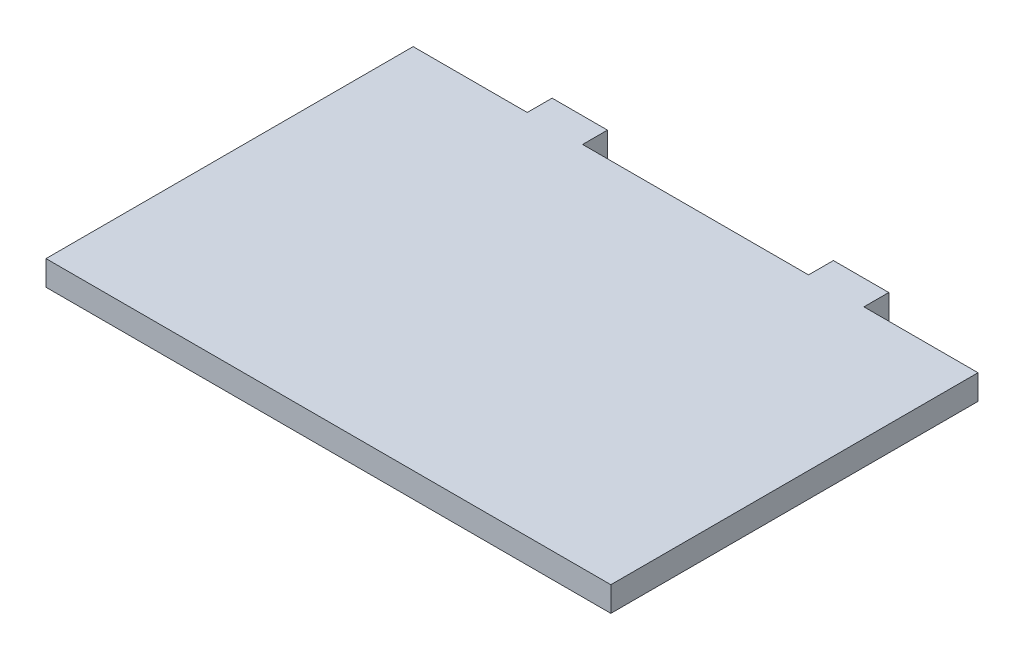
ISO-10303-21;
HEADER;
FILE_DESCRIPTION(('STEP AP214'),'2;1');
FILE_NAME('part.step','',(''),(''),'','','');
FILE_SCHEMA(('AUTOMOTIVE_DESIGN { 1 0 10303 214 1 1 1 1 }'));
ENDSEC;
DATA;
#1=APPLICATION_CONTEXT('core data for automotive mechanical design processes');
#2=APPLICATION_PROTOCOL_DEFINITION('international standard','automotive_design',2000,#1);
#3=PRODUCT_CONTEXT('',#1,'mechanical');
#4=PRODUCT('Part','Part','',(#3));
#5=PRODUCT_RELATED_PRODUCT_CATEGORY('part','',(#4));
#6=PRODUCT_DEFINITION_FORMATION('','',#4);
#7=PRODUCT_DEFINITION_CONTEXT('part definition',#1,'design');
#8=PRODUCT_DEFINITION('design','',#6,#7);
#9=PRODUCT_DEFINITION_SHAPE('','',#8);
#10=(LENGTH_UNIT() NAMED_UNIT(*) SI_UNIT(.MILLI.,.METRE.));
#11=(NAMED_UNIT(*) PLANE_ANGLE_UNIT() SI_UNIT($,.RADIAN.));
#12=(NAMED_UNIT(*) SI_UNIT($,.STERADIAN.) SOLID_ANGLE_UNIT());
#13=UNCERTAINTY_MEASURE_WITH_UNIT(LENGTH_MEASURE(1.E-05),#10,'distance_accuracy_value','');
#14=(GEOMETRIC_REPRESENTATION_CONTEXT(3) GLOBAL_UNCERTAINTY_ASSIGNED_CONTEXT((#13)) GLOBAL_UNIT_ASSIGNED_CONTEXT((#10,
#11,#12)) REPRESENTATION_CONTEXT('',''));
#15=CARTESIAN_POINT('',(0.,0.,0.));
#16=DIRECTION('',(0.,0.,1.));
#17=DIRECTION('',(1.,0.,0.));
#18=AXIS2_PLACEMENT_3D('',#15,#16,#17);
#19=CARTESIAN_POINT('',(37.846,5.588,-41.275));
#20=DIRECTION('',(0.,0.,1.));
#21=DIRECTION('',(1.,0.,0.));
#22=AXIS2_PLACEMENT_3D('',#19,#20,#21);
#23=PLANE('',#22);
#24=DIRECTION('',(-1.,0.,0.));
#25=VECTOR('',#24,1.);
#26=CARTESIAN_POINT('',(37.846,0.,-41.275));
#27=LINE('',#26,#25);
#28=CARTESIAN_POINT('',(63.5,0.,-41.275));
#29=VERTEX_POINT('',#28);
#30=CARTESIAN_POINT('',(37.846,0.,-41.275));
#31=VERTEX_POINT('',#30);
#32=EDGE_CURVE('E164',#29,#31,#27,.T.);
#33=ORIENTED_EDGE('',*,*,#32,.T.);
#34=DIRECTION('',(0.,-1.,0.));
#35=VECTOR('',#34,1.);
#36=CARTESIAN_POINT('',(37.846,5.588,-41.275));
#37=LINE('',#36,#35);
#38=CARTESIAN_POINT('',(37.846,5.588,-41.275));
#39=VERTEX_POINT('',#38);
#40=EDGE_CURVE('E11',#39,#31,#37,.T.);
#41=ORIENTED_EDGE('',*,*,#40,.F.);
#42=DIRECTION('',(-1.,0.,0.));
#43=VECTOR('',#42,1.);
#44=CARTESIAN_POINT('',(37.846,5.588,-41.275));
#45=LINE('',#44,#43);
#46=CARTESIAN_POINT('',(63.5,5.588,-41.275));
#47=VERTEX_POINT('',#46);
#48=EDGE_CURVE('E198',#47,#39,#45,.T.);
#49=ORIENTED_EDGE('',*,*,#48,.F.);
#50=DIRECTION('',(0.,-1.,0.));
#51=VECTOR('',#50,1.);
#52=CARTESIAN_POINT('',(63.5,5.588,-41.275));
#53=LINE('',#52,#51);
#54=EDGE_CURVE('E160',#47,#29,#53,.T.);
#55=ORIENTED_EDGE('',*,*,#54,.T.);
#56=EDGE_LOOP('',(#33,#41,#49,#55));
#57=FACE_BOUND('',#56,.T.);
#58=ADVANCED_FACE('F39',(#57),#23,.F.);
#59=CARTESIAN_POINT('',(37.846,5.588,-46.863));
#60=DIRECTION('',(-1.,0.,0.));
#61=DIRECTION('',(0.,0.,1.));
#62=AXIS2_PLACEMENT_3D('',#59,#60,#61);
#63=PLANE('',#62);
#64=DIRECTION('',(0.,0.,-1.));
#65=VECTOR('',#64,1.);
#66=CARTESIAN_POINT('',(37.846,0.,-46.863));
#67=LINE('',#66,#65);
#68=CARTESIAN_POINT('',(37.846,0.,-46.863));
#69=VERTEX_POINT('',#68);
#70=EDGE_CURVE('E168',#31,#69,#67,.T.);
#71=ORIENTED_EDGE('',*,*,#70,.T.);
#72=DIRECTION('',(0.,-1.,0.));
#73=VECTOR('',#72,1.);
#74=CARTESIAN_POINT('',(37.846,5.588,-46.863));
#75=LINE('',#74,#73);
#76=CARTESIAN_POINT('',(37.846,5.588,-46.863));
#77=VERTEX_POINT('',#76);
#78=EDGE_CURVE('E48',#77,#69,#75,.T.);
#79=ORIENTED_EDGE('',*,*,#78,.F.);
#80=DIRECTION('',(0.,0.,-1.));
#81=VECTOR('',#80,1.);
#82=CARTESIAN_POINT('',(37.846,5.588,-46.863));
#83=LINE('',#82,#81);
#84=EDGE_CURVE('E111',#39,#77,#83,.T.);
#85=ORIENTED_EDGE('',*,*,#84,.F.);
#86=ORIENTED_EDGE('',*,*,#40,.T.);
#87=EDGE_LOOP('',(#71,#79,#85,#86));
#88=FACE_BOUND('',#87,.T.);
#89=ADVANCED_FACE('F292',(#88),#63,.F.);
#90=CARTESIAN_POINT('',(25.4,5.588,-46.863));
#91=DIRECTION('',(0.,0.,1.));
#92=DIRECTION('',(1.,0.,0.));
#93=AXIS2_PLACEMENT_3D('',#90,#91,#92);
#94=PLANE('',#93);
#95=DIRECTION('',(-1.,0.,0.));
#96=VECTOR('',#95,1.);
#97=CARTESIAN_POINT('',(25.4,0.,-46.863));
#98=LINE('',#97,#96);
#99=CARTESIAN_POINT('',(25.4,0.,-46.863));
#100=VERTEX_POINT('',#99);
#101=EDGE_CURVE('E171',#69,#100,#98,.T.);
#102=ORIENTED_EDGE('',*,*,#101,.T.);
#103=DIRECTION('',(0.,-1.,0.));
#104=VECTOR('',#103,1.);
#105=CARTESIAN_POINT('',(25.4,5.588,-46.863));
#106=LINE('',#105,#104);
#107=CARTESIAN_POINT('',(25.4,5.588,-46.863));
#108=VERTEX_POINT('',#107);
#109=EDGE_CURVE('E225',#108,#100,#106,.T.);
#110=ORIENTED_EDGE('',*,*,#109,.F.);
#111=DIRECTION('',(-1.,0.,0.));
#112=VECTOR('',#111,1.);
#113=CARTESIAN_POINT('',(25.4,5.588,-46.863));
#114=LINE('',#113,#112);
#115=EDGE_CURVE('E235',#77,#108,#114,.T.);
#116=ORIENTED_EDGE('',*,*,#115,.F.);
#117=ORIENTED_EDGE('',*,*,#78,.T.);
#118=EDGE_LOOP('',(#102,#110,#116,#117));
#119=FACE_BOUND('',#118,.T.);
#120=ADVANCED_FACE('F233',(#119),#94,.F.);
#121=CARTESIAN_POINT('',(25.4,5.588,-41.275));
#122=DIRECTION('',(1.,0.,0.));
#123=DIRECTION('',(0.,0.,-1.));
#124=AXIS2_PLACEMENT_3D('',#121,#122,#123);
#125=PLANE('',#124);
#126=DIRECTION('',(0.,0.,1.));
#127=VECTOR('',#126,1.);
#128=CARTESIAN_POINT('',(25.4,0.,-41.275));
#129=LINE('',#128,#127);
#130=CARTESIAN_POINT('',(25.4,0.,-41.275));
#131=VERTEX_POINT('',#130);
#132=EDGE_CURVE('E174',#100,#131,#129,.T.);
#133=ORIENTED_EDGE('',*,*,#132,.T.);
#134=DIRECTION('',(0.,-1.,0.));
#135=VECTOR('',#134,1.);
#136=CARTESIAN_POINT('',(25.4,5.588,-41.275));
#137=LINE('',#136,#135);
#138=CARTESIAN_POINT('',(25.4,5.588,-41.275));
#139=VERTEX_POINT('',#138);
#140=EDGE_CURVE('E221',#139,#131,#137,.T.);
#141=ORIENTED_EDGE('',*,*,#140,.F.);
#142=DIRECTION('',(0.,0.,1.));
#143=VECTOR('',#142,1.);
#144=CARTESIAN_POINT('',(25.4,5.588,-41.275));
#145=LINE('',#144,#143);
#146=EDGE_CURVE('E254',#108,#139,#145,.T.);
#147=ORIENTED_EDGE('',*,*,#146,.F.);
#148=ORIENTED_EDGE('',*,*,#109,.T.);
#149=EDGE_LOOP('',(#133,#141,#147,#148));
#150=FACE_BOUND('',#149,.T.);
#151=ADVANCED_FACE('F244',(#150),#125,.F.);
#152=CARTESIAN_POINT('',(-25.4,5.588,-41.275));
#153=DIRECTION('',(0.,0.,1.));
#154=DIRECTION('',(1.,0.,0.));
#155=AXIS2_PLACEMENT_3D('',#152,#153,#154);
#156=PLANE('',#155);
#157=DIRECTION('',(-1.,0.,0.));
#158=VECTOR('',#157,1.);
#159=CARTESIAN_POINT('',(-25.4,0.,-41.275));
#160=LINE('',#159,#158);
#161=CARTESIAN_POINT('',(-25.4,0.,-41.275));
#162=VERTEX_POINT('',#161);
#163=EDGE_CURVE('E177',#131,#162,#160,.T.);
#164=ORIENTED_EDGE('',*,*,#163,.T.);
#165=DIRECTION('',(0.,-1.,0.));
#166=VECTOR('',#165,1.);
#167=CARTESIAN_POINT('',(-25.4,5.588,-41.275));
#168=LINE('',#167,#166);
#169=CARTESIAN_POINT('',(-25.4,5.588,-41.275));
#170=VERTEX_POINT('',#169);
#171=EDGE_CURVE('E217',#170,#162,#168,.T.);
#172=ORIENTED_EDGE('',*,*,#171,.F.);
#173=DIRECTION('',(-1.,0.,0.));
#174=VECTOR('',#173,1.);
#175=CARTESIAN_POINT('',(-25.4,5.588,-41.275));
#176=LINE('',#175,#174);
#177=EDGE_CURVE('E250',#139,#170,#176,.T.);
#178=ORIENTED_EDGE('',*,*,#177,.F.);
#179=ORIENTED_EDGE('',*,*,#140,.T.);
#180=EDGE_LOOP('',(#164,#172,#178,#179));
#181=FACE_BOUND('',#180,.T.);
#182=ADVANCED_FACE('F248',(#181),#156,.F.);
#183=CARTESIAN_POINT('',(-25.4,5.588,-46.863));
#184=DIRECTION('',(-1.,0.,0.));
#185=DIRECTION('',(0.,0.,1.));
#186=AXIS2_PLACEMENT_3D('',#183,#184,#185);
#187=PLANE('',#186);
#188=DIRECTION('',(0.,0.,-1.));
#189=VECTOR('',#188,1.);
#190=CARTESIAN_POINT('',(-25.4,0.,-46.863));
#191=LINE('',#190,#189);
#192=CARTESIAN_POINT('',(-25.4,0.,-46.863));
#193=VERTEX_POINT('',#192);
#194=EDGE_CURVE('E180',#162,#193,#191,.T.);
#195=ORIENTED_EDGE('',*,*,#194,.T.);
#196=DIRECTION('',(0.,-1.,0.));
#197=VECTOR('',#196,1.);
#198=CARTESIAN_POINT('',(-25.4,5.588,-46.863));
#199=LINE('',#198,#197);
#200=CARTESIAN_POINT('',(-25.4,5.588,-46.863));
#201=VERTEX_POINT('',#200);
#202=EDGE_CURVE('E213',#201,#193,#199,.T.);
#203=ORIENTED_EDGE('',*,*,#202,.F.);
#204=DIRECTION('',(0.,0.,-1.));
#205=VECTOR('',#204,1.);
#206=CARTESIAN_POINT('',(-25.4,5.588,-46.863));
#207=LINE('',#206,#205);
#208=EDGE_CURVE('E253',#170,#201,#207,.T.);
#209=ORIENTED_EDGE('',*,*,#208,.F.);
#210=ORIENTED_EDGE('',*,*,#171,.T.);
#211=EDGE_LOOP('',(#195,#203,#209,#210));
#212=FACE_BOUND('',#211,.T.);
#213=ADVANCED_FACE('F305',(#212),#187,.F.);
#214=CARTESIAN_POINT('',(-37.846,5.588,-46.863));
#215=DIRECTION('',(0.,0.,1.));
#216=DIRECTION('',(1.,0.,0.));
#217=AXIS2_PLACEMENT_3D('',#214,#215,#216);
#218=PLANE('',#217);
#219=DIRECTION('',(-1.,0.,0.));
#220=VECTOR('',#219,1.);
#221=CARTESIAN_POINT('',(-37.846,0.,-46.863));
#222=LINE('',#221,#220);
#223=CARTESIAN_POINT('',(-37.846,0.,-46.863));
#224=VERTEX_POINT('',#223);
#225=EDGE_CURVE('E183',#193,#224,#222,.T.);
#226=ORIENTED_EDGE('',*,*,#225,.T.);
#227=DIRECTION('',(0.,-1.,0.));
#228=VECTOR('',#227,1.);
#229=CARTESIAN_POINT('',(-37.846,5.588,-46.863));
#230=LINE('',#229,#228);
#231=CARTESIAN_POINT('',(-37.846,5.588,-46.863));
#232=VERTEX_POINT('',#231);
#233=EDGE_CURVE('E209',#232,#224,#230,.T.);
#234=ORIENTED_EDGE('',*,*,#233,.F.);
#235=DIRECTION('',(-1.,0.,0.));
#236=VECTOR('',#235,1.);
#237=CARTESIAN_POINT('',(-37.846,5.588,-46.863));
#238=LINE('',#237,#236);
#239=EDGE_CURVE('E258',#201,#232,#238,.T.);
#240=ORIENTED_EDGE('',*,*,#239,.F.);
#241=ORIENTED_EDGE('',*,*,#202,.T.);
#242=EDGE_LOOP('',(#226,#234,#240,#241));
#243=FACE_BOUND('',#242,.T.);
#244=ADVANCED_FACE('F308',(#243),#218,.F.);
#245=CARTESIAN_POINT('',(-37.846,5.588,-41.275));
#246=DIRECTION('',(1.,0.,0.));
#247=DIRECTION('',(0.,0.,-1.));
#248=AXIS2_PLACEMENT_3D('',#245,#246,#247);
#249=PLANE('',#248);
#250=DIRECTION('',(0.,0.,1.));
#251=VECTOR('',#250,1.);
#252=CARTESIAN_POINT('',(-37.846,0.,-41.275));
#253=LINE('',#252,#251);
#254=CARTESIAN_POINT('',(-37.846,0.,-41.275));
#255=VERTEX_POINT('',#254);
#256=EDGE_CURVE('E186',#224,#255,#253,.T.);
#257=ORIENTED_EDGE('',*,*,#256,.T.);
#258=DIRECTION('',(0.,-1.,0.));
#259=VECTOR('',#258,1.);
#260=CARTESIAN_POINT('',(-37.846,5.588,-41.275));
#261=LINE('',#260,#259);
#262=CARTESIAN_POINT('',(-37.846,5.588,-41.275));
#263=VERTEX_POINT('',#262);
#264=EDGE_CURVE('E205',#263,#255,#261,.T.);
#265=ORIENTED_EDGE('',*,*,#264,.F.);
#266=DIRECTION('',(0.,0.,1.));
#267=VECTOR('',#266,1.);
#268=CARTESIAN_POINT('',(-37.846,5.588,-41.275));
#269=LINE('',#268,#267);
#270=EDGE_CURVE('E265',#232,#263,#269,.T.);
#271=ORIENTED_EDGE('',*,*,#270,.F.);
#272=ORIENTED_EDGE('',*,*,#233,.T.);
#273=EDGE_LOOP('',(#257,#265,#271,#272));
#274=FACE_BOUND('',#273,.T.);
#275=ADVANCED_FACE('F273',(#274),#249,.F.);
#276=CARTESIAN_POINT('',(-63.5,5.588,-41.275));
#277=DIRECTION('',(0.,0.,1.));
#278=DIRECTION('',(1.,0.,0.));
#279=AXIS2_PLACEMENT_3D('',#276,#277,#278);
#280=PLANE('',#279);
#281=DIRECTION('',(-1.,0.,0.));
#282=VECTOR('',#281,1.);
#283=CARTESIAN_POINT('',(-63.5,0.,-41.275));
#284=LINE('',#283,#282);
#285=CARTESIAN_POINT('',(-63.5,0.,-41.275));
#286=VERTEX_POINT('',#285);
#287=EDGE_CURVE('E189',#255,#286,#284,.T.);
#288=ORIENTED_EDGE('',*,*,#287,.T.);
#289=DIRECTION('',(0.,-1.,0.));
#290=VECTOR('',#289,1.);
#291=CARTESIAN_POINT('',(-63.5,5.588,-41.275));
#292=LINE('',#291,#290);
#293=CARTESIAN_POINT('',(-63.5,5.588,-41.275));
#294=VERTEX_POINT('',#293);
#295=EDGE_CURVE('E153',#294,#286,#292,.T.);
#296=ORIENTED_EDGE('',*,*,#295,.F.);
#297=DIRECTION('',(-1.,0.,0.));
#298=VECTOR('',#297,1.);
#299=CARTESIAN_POINT('',(-63.5,5.588,-41.275));
#300=LINE('',#299,#298);
#301=EDGE_CURVE('E142',#263,#294,#300,.T.);
#302=ORIENTED_EDGE('',*,*,#301,.F.);
#303=ORIENTED_EDGE('',*,*,#264,.T.);
#304=EDGE_LOOP('',(#288,#296,#302,#303));
#305=FACE_BOUND('',#304,.T.);
#306=ADVANCED_FACE('F277',(#305),#280,.F.);
#307=CARTESIAN_POINT('',(-63.5,5.588,41.275));
#308=DIRECTION('',(1.,0.,0.));
#309=DIRECTION('',(0.,0.,-1.));
#310=AXIS2_PLACEMENT_3D('',#307,#308,#309);
#311=PLANE('',#310);
#312=DIRECTION('',(0.,0.,1.));
#313=VECTOR('',#312,1.);
#314=CARTESIAN_POINT('',(-63.5,0.,41.275));
#315=LINE('',#314,#313);
#316=CARTESIAN_POINT('',(-63.5,0.,41.275));
#317=VERTEX_POINT('',#316);
#318=EDGE_CURVE('E151',#286,#317,#315,.T.);
#319=ORIENTED_EDGE('',*,*,#318,.T.);
#320=DIRECTION('',(0.,-1.,0.));
#321=VECTOR('',#320,1.);
#322=CARTESIAN_POINT('',(-63.5,5.588,41.275));
#323=LINE('',#322,#321);
#324=CARTESIAN_POINT('',(-63.5,5.588,41.275));
#325=VERTEX_POINT('',#324);
#326=EDGE_CURVE('E148',#325,#317,#323,.T.);
#327=ORIENTED_EDGE('',*,*,#326,.F.);
#328=DIRECTION('',(0.,0.,1.));
#329=VECTOR('',#328,1.);
#330=CARTESIAN_POINT('',(-63.5,5.588,41.275));
#331=LINE('',#330,#329);
#332=EDGE_CURVE('E136',#294,#325,#331,.T.);
#333=ORIENTED_EDGE('',*,*,#332,.F.);
#334=ORIENTED_EDGE('',*,*,#295,.T.);
#335=EDGE_LOOP('',(#319,#327,#333,#334));
#336=FACE_BOUND('',#335,.T.);
#337=ADVANCED_FACE('F149',(#336),#311,.F.);
#338=CARTESIAN_POINT('',(-63.5,5.588,41.275));
#339=DIRECTION('',(0.,0.,-1.));
#340=DIRECTION('',(-1.,0.,0.));
#341=AXIS2_PLACEMENT_3D('',#338,#339,#340);
#342=PLANE('',#341);
#343=DIRECTION('',(1.,0.,0.));
#344=VECTOR('',#343,1.);
#345=CARTESIAN_POINT('',(-63.5,0.,41.275));
#346=LINE('',#345,#344);
#347=CARTESIAN_POINT('',(63.5,0.,41.275));
#348=VERTEX_POINT('',#347);
#349=EDGE_CURVE('E97',#317,#348,#346,.T.);
#350=ORIENTED_EDGE('',*,*,#349,.T.);
#351=DIRECTION('',(0.,-1.,0.));
#352=VECTOR('',#351,1.);
#353=CARTESIAN_POINT('',(63.5,5.588,41.275));
#354=LINE('',#353,#352);
#355=CARTESIAN_POINT('',(63.5,5.588,41.275));
#356=VERTEX_POINT('',#355);
#357=EDGE_CURVE('E154',#356,#348,#354,.T.);
#358=ORIENTED_EDGE('',*,*,#357,.F.);
#359=DIRECTION('',(1.,0.,0.));
#360=VECTOR('',#359,1.);
#361=CARTESIAN_POINT('',(-63.5,5.588,41.275));
#362=LINE('',#361,#360);
#363=EDGE_CURVE('E140',#325,#356,#362,.T.);
#364=ORIENTED_EDGE('',*,*,#363,.F.);
#365=ORIENTED_EDGE('',*,*,#326,.T.);
#366=EDGE_LOOP('',(#350,#358,#364,#365));
#367=FACE_BOUND('',#366,.T.);
#368=ADVANCED_FACE('F156',(#367),#342,.F.);
#369=CARTESIAN_POINT('',(63.5,5.588,41.275));
#370=DIRECTION('',(-1.,0.,0.));
#371=DIRECTION('',(0.,0.,1.));
#372=AXIS2_PLACEMENT_3D('',#369,#370,#371);
#373=PLANE('',#372);
#374=DIRECTION('',(0.,0.,-1.));
#375=VECTOR('',#374,1.);
#376=CARTESIAN_POINT('',(63.5,0.,41.275));
#377=LINE('',#376,#375);
#378=EDGE_CURVE('E103',#348,#29,#377,.T.);
#379=ORIENTED_EDGE('',*,*,#378,.T.);
#380=ORIENTED_EDGE('',*,*,#54,.F.);
#381=DIRECTION('',(0.,0.,-1.));
#382=VECTOR('',#381,1.);
#383=CARTESIAN_POINT('',(63.5,5.588,41.275));
#384=LINE('',#383,#382);
#385=EDGE_CURVE('E56',#356,#47,#384,.T.);
#386=ORIENTED_EDGE('',*,*,#385,.F.);
#387=ORIENTED_EDGE('',*,*,#357,.T.);
#388=EDGE_LOOP('',(#379,#380,#386,#387));
#389=FACE_BOUND('',#388,.T.);
#390=ADVANCED_FACE('F281',(#389),#373,.F.);
#391=CARTESIAN_POINT('',(0.,5.588,0.));
#392=DIRECTION('',(0.,1.,0.));
#393=DIRECTION('',(0.,0.,1.));
#394=AXIS2_PLACEMENT_3D('',#391,#392,#393);
#395=PLANE('',#394);
#396=ORIENTED_EDGE('',*,*,#48,.T.);
#397=ORIENTED_EDGE('',*,*,#84,.T.);
#398=ORIENTED_EDGE('',*,*,#115,.T.);
#399=ORIENTED_EDGE('',*,*,#146,.T.);
#400=ORIENTED_EDGE('',*,*,#177,.T.);
#401=ORIENTED_EDGE('',*,*,#208,.T.);
#402=ORIENTED_EDGE('',*,*,#239,.T.);
#403=ORIENTED_EDGE('',*,*,#270,.T.);
#404=ORIENTED_EDGE('',*,*,#301,.T.);
#405=ORIENTED_EDGE('',*,*,#332,.T.);
#406=ORIENTED_EDGE('',*,*,#363,.T.);
#407=ORIENTED_EDGE('',*,*,#385,.T.);
#408=EDGE_LOOP('',(#396,#397,#398,#399,#400,#401,#402,#403,#404,#405,#406,#407));
#409=FACE_BOUND('',#408,.T.);
#410=ADVANCED_FACE('F138',(#409),#395,.T.);
#411=CARTESIAN_POINT('',(0.,0.,0.));
#412=DIRECTION('',(0.,1.,0.));
#413=DIRECTION('',(0.,0.,1.));
#414=AXIS2_PLACEMENT_3D('',#411,#412,#413);
#415=PLANE('',#414);
#416=ORIENTED_EDGE('',*,*,#32,.F.);
#417=ORIENTED_EDGE('',*,*,#378,.F.);
#418=ORIENTED_EDGE('',*,*,#349,.F.);
#419=ORIENTED_EDGE('',*,*,#318,.F.);
#420=ORIENTED_EDGE('',*,*,#287,.F.);
#421=ORIENTED_EDGE('',*,*,#256,.F.);
#422=ORIENTED_EDGE('',*,*,#225,.F.);
#423=ORIENTED_EDGE('',*,*,#194,.F.);
#424=ORIENTED_EDGE('',*,*,#163,.F.);
#425=ORIENTED_EDGE('',*,*,#132,.F.);
#426=ORIENTED_EDGE('',*,*,#101,.F.);
#427=ORIENTED_EDGE('',*,*,#70,.F.);
#428=EDGE_LOOP('',(#416,#417,#418,#419,#420,#421,#422,#423,#424,#425,#426,#427));
#429=FACE_BOUND('',#428,.T.);
#430=ADVANCED_FACE('F239',(#429),#415,.F.);
#431=CLOSED_SHELL('',(#58,#89,#120,#151,#182,#213,#244,#275,#306,#337,#368,#390,#410,#430));
#432=MANIFOLD_SOLID_BREP('B2',#431);
#433=ADVANCED_BREP_SHAPE_REPRESENTATION('',(#18,#432),#14);
#434=SHAPE_DEFINITION_REPRESENTATION(#9,#433);
ENDSEC;
END-ISO-10303-21;
